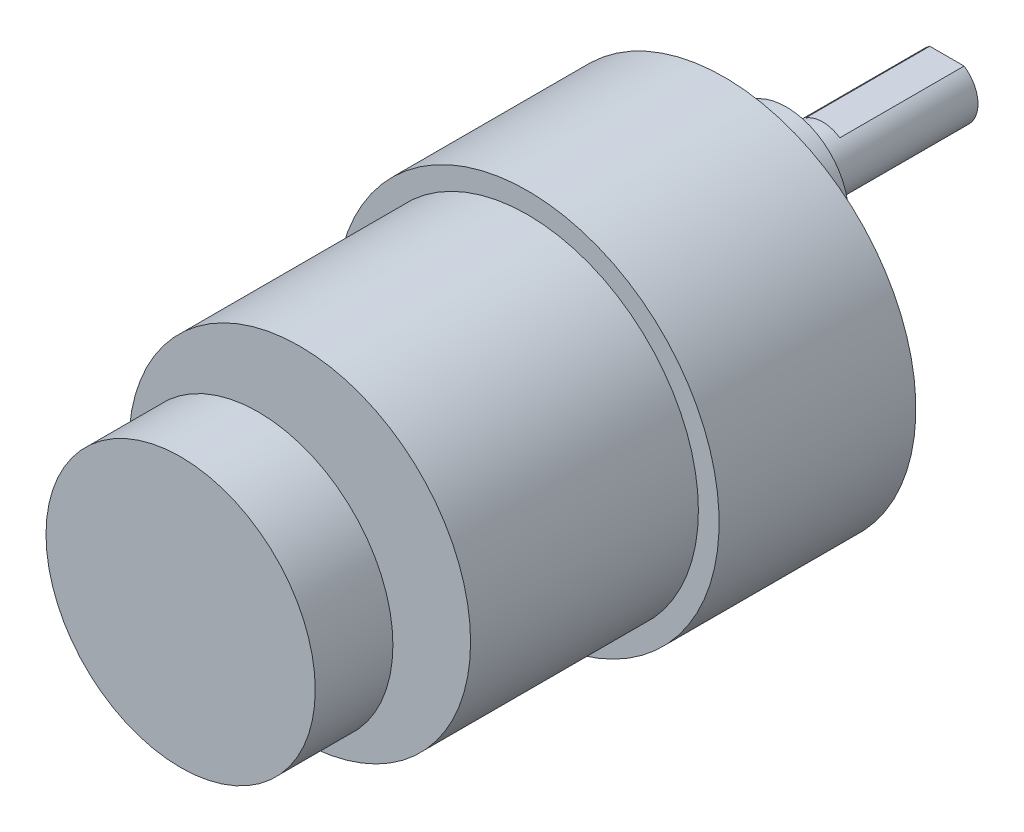
ISO-10303-21;
HEADER;
FILE_DESCRIPTION(('STEP AP214'),'2;1');
FILE_NAME('part.step','',(''),(''),'','','');
FILE_SCHEMA(('AUTOMOTIVE_DESIGN { 1 0 10303 214 1 1 1 1 }'));
ENDSEC;
DATA;
#1=APPLICATION_CONTEXT('core data for automotive mechanical design processes');
#2=APPLICATION_PROTOCOL_DEFINITION('international standard','automotive_design',2000,#1);
#3=PRODUCT_CONTEXT('',#1,'mechanical');
#4=PRODUCT('Part','Part','',(#3));
#5=PRODUCT_RELATED_PRODUCT_CATEGORY('part','',(#4));
#6=PRODUCT_DEFINITION_FORMATION('','',#4);
#7=PRODUCT_DEFINITION_CONTEXT('part definition',#1,'design');
#8=PRODUCT_DEFINITION('design','',#6,#7);
#9=PRODUCT_DEFINITION_SHAPE('','',#8);
#10=(LENGTH_UNIT() NAMED_UNIT(*) SI_UNIT(.MILLI.,.METRE.));
#11=(NAMED_UNIT(*) PLANE_ANGLE_UNIT() SI_UNIT($,.RADIAN.));
#12=(NAMED_UNIT(*) SI_UNIT($,.STERADIAN.) SOLID_ANGLE_UNIT());
#13=UNCERTAINTY_MEASURE_WITH_UNIT(LENGTH_MEASURE(1.E-05),#10,'distance_accuracy_value','');
#14=(GEOMETRIC_REPRESENTATION_CONTEXT(3) GLOBAL_UNCERTAINTY_ASSIGNED_CONTEXT((#13)) GLOBAL_UNIT_ASSIGNED_CONTEXT((#10,
#11,#12)) REPRESENTATION_CONTEXT('',''));
#15=CARTESIAN_POINT('',(0.,0.,0.));
#16=DIRECTION('',(0.,0.,1.));
#17=DIRECTION('',(1.,0.,0.));
#18=AXIS2_PLACEMENT_3D('',#15,#16,#17);
#19=CARTESIAN_POINT('',(0.,0.,22.));
#20=DIRECTION('',(0.,0.,1.));
#21=DIRECTION('',(1.,0.,0.));
#22=AXIS2_PLACEMENT_3D('',#19,#20,#21);
#23=PLANE('',#22);
#24=CARTESIAN_POINT('',(0.,0.,22.));
#25=DIRECTION('',(0.,0.,1.));
#26=DIRECTION('',(1.,0.,0.));
#27=AXIS2_PLACEMENT_3D('',#24,#25,#26);
#28=CIRCLE('',#27,16.5);
#29=CARTESIAN_POINT('',(16.5,0.,22.));
#30=VERTEX_POINT('',#29);
#31=EDGE_CURVE('E52',#30,#30,#28,.T.);
#32=ORIENTED_EDGE('',*,*,#31,.T.);
#33=EDGE_LOOP('',(#32));
#34=FACE_BOUND('',#33,.T.);
#35=DIRECTION('',(1.,0.,0.));
#36=VECTOR('',#35,1.);
#37=CARTESIAN_POINT('',(-6.06813562203251,-2.5,22.));
#38=LINE('',#37,#36);
#39=CARTESIAN_POINT('',(-6.06813562203251,-2.5,22.));
#40=VERTEX_POINT('',#39);
#41=CARTESIAN_POINT('',(-4.06813562203251,-2.5,22.));
#42=VERTEX_POINT('',#41);
#43=EDGE_CURVE('E176',#40,#42,#38,.T.);
#44=ORIENTED_EDGE('',*,*,#43,.F.);
#45=DIRECTION('',(0.,-1.,0.));
#46=VECTOR('',#45,1.);
#47=CARTESIAN_POINT('',(-6.06813562203251,2.5,22.));
#48=LINE('',#47,#46);
#49=CARTESIAN_POINT('',(-6.06813562203251,2.5,22.));
#50=VERTEX_POINT('',#49);
#51=EDGE_CURVE('E181',#50,#40,#48,.T.);
#52=ORIENTED_EDGE('',*,*,#51,.F.);
#53=DIRECTION('',(-1.,0.,0.));
#54=VECTOR('',#53,1.);
#55=CARTESIAN_POINT('',(-6.06813562203251,2.5,22.));
#56=LINE('',#55,#54);
#57=CARTESIAN_POINT('',(-4.06813562203251,2.5,22.));
#58=VERTEX_POINT('',#57);
#59=EDGE_CURVE('E166',#58,#50,#56,.T.);
#60=ORIENTED_EDGE('',*,*,#59,.F.);
#61=DIRECTION('',(0.,1.,0.));
#62=VECTOR('',#61,1.);
#63=CARTESIAN_POINT('',(-4.06813562203251,2.5,22.));
#64=LINE('',#63,#62);
#65=EDGE_CURVE('E172',#42,#58,#64,.T.);
#66=ORIENTED_EDGE('',*,*,#65,.F.);
#67=EDGE_LOOP('',(#44,#52,#60,#66));
#68=FACE_BOUND('',#67,.T.);
#69=DIRECTION('',(0.,-1.,0.));
#70=VECTOR('',#69,1.);
#71=CARTESIAN_POINT('',(4.06813562203251,2.5,22.));
#72=LINE('',#71,#70);
#73=CARTESIAN_POINT('',(4.06813562203251,2.5,22.));
#74=VERTEX_POINT('',#73);
#75=CARTESIAN_POINT('',(4.06813562203251,-2.5,22.));
#76=VERTEX_POINT('',#75);
#77=EDGE_CURVE('E128',#74,#76,#72,.T.);
#78=ORIENTED_EDGE('',*,*,#77,.F.);
#79=DIRECTION('',(-1.,0.,0.));
#80=VECTOR('',#79,1.);
#81=CARTESIAN_POINT('',(6.06813562203251,2.5,22.));
#82=LINE('',#81,#80);
#83=CARTESIAN_POINT('',(6.06813562203251,2.5,22.));
#84=VERTEX_POINT('',#83);
#85=EDGE_CURVE('E132',#84,#74,#82,.T.);
#86=ORIENTED_EDGE('',*,*,#85,.F.);
#87=DIRECTION('',(0.,1.,0.));
#88=VECTOR('',#87,1.);
#89=CARTESIAN_POINT('',(6.06813562203251,2.5,22.));
#90=LINE('',#89,#88);
#91=CARTESIAN_POINT('',(6.06813562203251,-2.5,22.));
#92=VERTEX_POINT('',#91);
#93=EDGE_CURVE('E153',#92,#84,#90,.T.);
#94=ORIENTED_EDGE('',*,*,#93,.F.);
#95=DIRECTION('',(1.,0.,0.));
#96=VECTOR('',#95,1.);
#97=CARTESIAN_POINT('',(6.06813562203251,-2.5,22.));
#98=LINE('',#97,#96);
#99=EDGE_CURVE('E60',#76,#92,#98,.T.);
#100=ORIENTED_EDGE('',*,*,#99,.F.);
#101=EDGE_LOOP('',(#78,#86,#94,#100));
#102=FACE_BOUND('',#101,.T.);
#103=ADVANCED_FACE('F42',(#34,#68,#102),#23,.T.);
#104=CARTESIAN_POINT('',(0.,0.,26.));
#105=DIRECTION('',(0.,0.,1.));
#106=DIRECTION('',(1.,0.,0.));
#107=AXIS2_PLACEMENT_3D('',#104,#105,#106);
#108=PLANE('',#107);
#109=DIRECTION('',(0.,1.,0.));
#110=VECTOR('',#109,1.);
#111=CARTESIAN_POINT('',(-4.06813562203251,2.5,26.));
#112=LINE('',#111,#110);
#113=CARTESIAN_POINT('',(-4.06813562203251,-2.5,26.));
#114=VERTEX_POINT('',#113);
#115=CARTESIAN_POINT('',(-4.06813562203251,2.5,26.));
#116=VERTEX_POINT('',#115);
#117=EDGE_CURVE('E185',#114,#116,#112,.T.);
#118=ORIENTED_EDGE('',*,*,#117,.T.);
#119=DIRECTION('',(-1.,0.,0.));
#120=VECTOR('',#119,1.);
#121=CARTESIAN_POINT('',(-6.06813562203251,2.5,26.));
#122=LINE('',#121,#120);
#123=CARTESIAN_POINT('',(-6.06813562203251,2.5,26.));
#124=VERTEX_POINT('',#123);
#125=EDGE_CURVE('E170',#116,#124,#122,.T.);
#126=ORIENTED_EDGE('',*,*,#125,.T.);
#127=DIRECTION('',(0.,-1.,0.));
#128=VECTOR('',#127,1.);
#129=CARTESIAN_POINT('',(-6.06813562203251,2.5,26.));
#130=LINE('',#129,#128);
#131=CARTESIAN_POINT('',(-6.06813562203251,-2.5,26.));
#132=VERTEX_POINT('',#131);
#133=EDGE_CURVE('E194',#124,#132,#130,.T.);
#134=ORIENTED_EDGE('',*,*,#133,.T.);
#135=DIRECTION('',(1.,0.,0.));
#136=VECTOR('',#135,1.);
#137=CARTESIAN_POINT('',(-6.06813562203251,-2.5,26.));
#138=LINE('',#137,#136);
#139=EDGE_CURVE('E190',#132,#114,#138,.T.);
#140=ORIENTED_EDGE('',*,*,#139,.T.);
#141=EDGE_LOOP('',(#118,#126,#134,#140));
#142=FACE_BOUND('',#141,.T.);
#143=CARTESIAN_POINT('',(0.,0.,26.));
#144=DIRECTION('',(0.,0.,1.));
#145=DIRECTION('',(1.,0.,0.));
#146=AXIS2_PLACEMENT_3D('',#143,#144,#145);
#147=CIRCLE('',#146,13.);
#148=CARTESIAN_POINT('',(13.,0.,26.));
#149=VERTEX_POINT('',#148);
#150=EDGE_CURVE('E162',#149,#149,#147,.T.);
#151=ORIENTED_EDGE('',*,*,#150,.F.);
#152=EDGE_LOOP('',(#151));
#153=FACE_BOUND('',#152,.T.);
#154=DIRECTION('',(-1.,0.,0.));
#155=VECTOR('',#154,1.);
#156=CARTESIAN_POINT('',(6.06813562203251,2.5,26.));
#157=LINE('',#156,#155);
#158=CARTESIAN_POINT('',(6.06813562203251,2.5,26.));
#159=VERTEX_POINT('',#158);
#160=CARTESIAN_POINT('',(4.06813562203251,2.5,26.));
#161=VERTEX_POINT('',#160);
#162=EDGE_CURVE('E68',#159,#161,#157,.T.);
#163=ORIENTED_EDGE('',*,*,#162,.T.);
#164=DIRECTION('',(0.,-1.,0.));
#165=VECTOR('',#164,1.);
#166=CARTESIAN_POINT('',(4.06813562203251,2.5,26.));
#167=LINE('',#166,#165);
#168=CARTESIAN_POINT('',(4.06813562203251,-2.5,26.));
#169=VERTEX_POINT('',#168);
#170=EDGE_CURVE('E129',#161,#169,#167,.T.);
#171=ORIENTED_EDGE('',*,*,#170,.T.);
#172=DIRECTION('',(1.,0.,0.));
#173=VECTOR('',#172,1.);
#174=CARTESIAN_POINT('',(6.06813562203251,-2.5,26.));
#175=LINE('',#174,#173);
#176=CARTESIAN_POINT('',(6.06813562203251,-2.5,26.));
#177=VERTEX_POINT('',#176);
#178=EDGE_CURVE('E729',#169,#177,#175,.T.);
#179=ORIENTED_EDGE('',*,*,#178,.T.);
#180=DIRECTION('',(0.,1.,0.));
#181=VECTOR('',#180,1.);
#182=CARTESIAN_POINT('',(6.06813562203251,2.5,26.));
#183=LINE('',#182,#181);
#184=EDGE_CURVE('E156',#177,#159,#183,.T.);
#185=ORIENTED_EDGE('',*,*,#184,.T.);
#186=EDGE_LOOP('',(#163,#171,#179,#185));
#187=FACE_BOUND('',#186,.T.);
#188=ADVANCED_FACE('F320',(#142,#153,#187),#108,.F.);
#189=CARTESIAN_POINT('',(0.,0.,22.));
#190=DIRECTION('',(0.,0.,-1.));
#191=DIRECTION('',(-1.,0.,0.));
#192=AXIS2_PLACEMENT_3D('',#189,#190,#191);
#193=CYLINDRICAL_SURFACE('',#192,16.5);
#194=ORIENTED_EDGE('',*,*,#31,.F.);
#195=EDGE_LOOP('',(#194));
#196=FACE_BOUND('',#195,.T.);
#197=CARTESIAN_POINT('',(0.,0.,0.));
#198=DIRECTION('',(0.,0.,1.));
#199=DIRECTION('',(1.,0.,0.));
#200=AXIS2_PLACEMENT_3D('',#197,#198,#199);
#201=CIRCLE('',#200,16.5);
#202=CARTESIAN_POINT('',(16.5,0.,0.));
#203=VERTEX_POINT('',#202);
#204=EDGE_CURVE('E46',#203,#203,#201,.T.);
#205=ORIENTED_EDGE('',*,*,#204,.T.);
#206=EDGE_LOOP('',(#205));
#207=FACE_BOUND('',#206,.T.);
#208=ADVANCED_FACE('F44',(#196,#207),#193,.T.);
#209=CARTESIAN_POINT('',(0.,0.,-19.));
#210=DIRECTION('',(0.,0.,1.));
#211=DIRECTION('',(1.,0.,0.));
#212=AXIS2_PLACEMENT_3D('',#209,#210,#211);
#213=CYLINDRICAL_SURFACE('',#212,18.5);
#214=CARTESIAN_POINT('',(0.,0.,-19.));
#215=DIRECTION('',(0.,0.,-1.));
#216=DIRECTION('',(-1.,0.,0.));
#217=AXIS2_PLACEMENT_3D('',#214,#215,#216);
#218=CIRCLE('',#217,18.5);
#219=CARTESIAN_POINT('',(-18.5,0.,-19.));
#220=VERTEX_POINT('',#219);
#221=EDGE_CURVE('E287',#220,#220,#218,.T.);
#222=ORIENTED_EDGE('',*,*,#221,.F.);
#223=EDGE_LOOP('',(#222));
#224=FACE_BOUND('',#223,.T.);
#225=CARTESIAN_POINT('',(0.,0.,0.));
#226=DIRECTION('',(0.,0.,-1.));
#227=DIRECTION('',(-1.,0.,0.));
#228=AXIS2_PLACEMENT_3D('',#225,#226,#227);
#229=CIRCLE('',#228,18.5);
#230=CARTESIAN_POINT('',(-18.5,0.,0.));
#231=VERTEX_POINT('',#230);
#232=EDGE_CURVE('E283',#231,#231,#229,.T.);
#233=ORIENTED_EDGE('',*,*,#232,.T.);
#234=EDGE_LOOP('',(#233));
#235=FACE_BOUND('',#234,.T.);
#236=ADVANCED_FACE('F310',(#224,#235),#213,.T.);
#237=CARTESIAN_POINT('',(0.,0.,-19.));
#238=DIRECTION('',(0.,0.,-1.));
#239=DIRECTION('',(-1.,0.,0.));
#240=AXIS2_PLACEMENT_3D('',#237,#238,#239);
#241=PLANE('',#240);
#242=CARTESIAN_POINT('',(15.5,0.,-19.));
#243=DIRECTION('',(0.,0.,-1.));
#244=DIRECTION('',(-1.,0.,0.));
#245=AXIS2_PLACEMENT_3D('',#242,#243,#244);
#246=CIRCLE('',#245,1.5);
#247=CARTESIAN_POINT('',(14.,0.,-19.));
#248=VERTEX_POINT('',#247);
#249=EDGE_CURVE('E215',#248,#248,#246,.T.);
#250=ORIENTED_EDGE('',*,*,#249,.F.);
#251=EDGE_LOOP('',(#250));
#252=FACE_BOUND('',#251,.T.);
#253=CARTESIAN_POINT('',(7.75000000000016,-13.4233937586587,-19.));
#254=DIRECTION('',(0.,0.,-1.));
#255=DIRECTION('',(-1.,0.,0.));
#256=AXIS2_PLACEMENT_3D('',#253,#254,#255);
#257=CIRCLE('',#256,1.5);
#258=CARTESIAN_POINT('',(6.25000000000015,-13.4233937586587,-19.));
#259=VERTEX_POINT('',#258);
#260=EDGE_CURVE('E220',#259,#259,#257,.T.);
#261=ORIENTED_EDGE('',*,*,#260,.F.);
#262=EDGE_LOOP('',(#261));
#263=FACE_BOUND('',#262,.T.);
#264=CARTESIAN_POINT('',(-7.74999999999987,-13.4233937586589,-19.));
#265=DIRECTION('',(0.,0.,-1.));
#266=DIRECTION('',(-1.,0.,0.));
#267=AXIS2_PLACEMENT_3D('',#264,#265,#266);
#268=CIRCLE('',#267,1.5);
#269=CARTESIAN_POINT('',(-9.24999999999988,-13.4233937586589,-19.));
#270=VERTEX_POINT('',#269);
#271=EDGE_CURVE('E251',#270,#270,#268,.T.);
#272=ORIENTED_EDGE('',*,*,#271,.F.);
#273=EDGE_LOOP('',(#272));
#274=FACE_BOUND('',#273,.T.);
#275=CARTESIAN_POINT('',(-15.5,-1.08235921504137E-13,-19.));
#276=DIRECTION('',(0.,0.,-1.));
#277=DIRECTION('',(-1.,0.,0.));
#278=AXIS2_PLACEMENT_3D('',#275,#276,#277);
#279=CIRCLE('',#278,1.5);
#280=CARTESIAN_POINT('',(-17.,-1.08235921504137E-13,-19.));
#281=VERTEX_POINT('',#280);
#282=EDGE_CURVE('E243',#281,#281,#279,.T.);
#283=ORIENTED_EDGE('',*,*,#282,.F.);
#284=EDGE_LOOP('',(#283));
#285=FACE_BOUND('',#284,.T.);
#286=CARTESIAN_POINT('',(-7.75000000000006,13.4233937586588,-19.));
#287=DIRECTION('',(0.,0.,-1.));
#288=DIRECTION('',(-1.,0.,0.));
#289=AXIS2_PLACEMENT_3D('',#286,#287,#288);
#290=CIRCLE('',#289,1.5);
#291=CARTESIAN_POINT('',(-9.25000000000006,13.4233937586588,-19.));
#292=VERTEX_POINT('',#291);
#293=EDGE_CURVE('E235',#292,#292,#290,.T.);
#294=ORIENTED_EDGE('',*,*,#293,.F.);
#295=EDGE_LOOP('',(#294));
#296=FACE_BOUND('',#295,.T.);
#297=CARTESIAN_POINT('',(7.74999999999997,13.4233937586588,-19.));
#298=DIRECTION('',(0.,0.,-1.));
#299=DIRECTION('',(-1.,0.,0.));
#300=AXIS2_PLACEMENT_3D('',#297,#298,#299);
#301=CIRCLE('',#300,1.5);
#302=CARTESIAN_POINT('',(6.24999999999997,13.4233937586588,-19.));
#303=VERTEX_POINT('',#302);
#304=EDGE_CURVE('E219',#303,#303,#301,.T.);
#305=ORIENTED_EDGE('',*,*,#304,.F.);
#306=EDGE_LOOP('',(#305));
#307=FACE_BOUND('',#306,.T.);
#308=CARTESIAN_POINT('',(0.,7.,-19.));
#309=DIRECTION('',(0.,0.,-1.));
#310=DIRECTION('',(-1.,0.,0.));
#311=AXIS2_PLACEMENT_3D('',#308,#309,#310);
#312=CIRCLE('',#311,6.);
#313=CARTESIAN_POINT('',(-6.,7.,-19.));
#314=VERTEX_POINT('',#313);
#315=EDGE_CURVE('E277',#314,#314,#312,.T.);
#316=ORIENTED_EDGE('',*,*,#315,.F.);
#317=EDGE_LOOP('',(#316));
#318=FACE_BOUND('',#317,.T.);
#319=ORIENTED_EDGE('',*,*,#221,.T.);
#320=EDGE_LOOP('',(#319));
#321=FACE_BOUND('',#320,.T.);
#322=ADVANCED_FACE('F306',(#252,#263,#274,#285,#296,#307,#318,#321),#241,.T.);
#323=CARTESIAN_POINT('',(0.,0.,0.));
#324=DIRECTION('',(0.,0.,-1.));
#325=DIRECTION('',(-1.,0.,0.));
#326=AXIS2_PLACEMENT_3D('',#323,#324,#325);
#327=PLANE('',#326);
#328=ORIENTED_EDGE('',*,*,#204,.F.);
#329=EDGE_LOOP('',(#328));
#330=FACE_BOUND('',#329,.T.);
#331=ORIENTED_EDGE('',*,*,#232,.F.);
#332=EDGE_LOOP('',(#331));
#333=FACE_BOUND('',#332,.T.);
#334=ADVANCED_FACE('F302',(#330,#333),#327,.F.);
#335=CARTESIAN_POINT('',(0.,7.,-25.));
#336=DIRECTION('',(0.,0.,1.));
#337=DIRECTION('',(1.,0.,0.));
#338=AXIS2_PLACEMENT_3D('',#335,#336,#337);
#339=CYLINDRICAL_SURFACE('',#338,6.);
#340=CARTESIAN_POINT('',(0.,7.,-25.));
#341=DIRECTION('',(0.,0.,-1.));
#342=DIRECTION('',(-1.,0.,0.));
#343=AXIS2_PLACEMENT_3D('',#340,#341,#342);
#344=CIRCLE('',#343,6.);
#345=CARTESIAN_POINT('',(-6.,7.,-25.));
#346=VERTEX_POINT('',#345);
#347=EDGE_CURVE('E279',#346,#346,#344,.T.);
#348=ORIENTED_EDGE('',*,*,#347,.F.);
#349=EDGE_LOOP('',(#348));
#350=FACE_BOUND('',#349,.T.);
#351=ORIENTED_EDGE('',*,*,#315,.T.);
#352=EDGE_LOOP('',(#351));
#353=FACE_BOUND('',#352,.T.);
#354=ADVANCED_FACE('F305',(#350,#353),#339,.T.);
#355=CARTESIAN_POINT('',(0.,7.,-25.));
#356=DIRECTION('',(0.,0.,-1.));
#357=DIRECTION('',(-1.,0.,0.));
#358=AXIS2_PLACEMENT_3D('',#355,#356,#357);
#359=PLANE('',#358);
#360=CARTESIAN_POINT('',(0.,7.,-25.));
#361=DIRECTION('',(0.,0.,-1.));
#362=DIRECTION('',(-1.,0.,0.));
#363=AXIS2_PLACEMENT_3D('',#360,#361,#362);
#364=CIRCLE('',#363,3.);
#365=CARTESIAN_POINT('',(-3.,7.,-25.));
#366=VERTEX_POINT('',#365);
#367=EDGE_CURVE('E11',#366,#366,#364,.T.);
#368=ORIENTED_EDGE('',*,*,#367,.F.);
#369=EDGE_LOOP('',(#368));
#370=FACE_BOUND('',#369,.T.);
#371=ORIENTED_EDGE('',*,*,#347,.T.);
#372=EDGE_LOOP('',(#371));
#373=FACE_BOUND('',#372,.T.);
#374=ADVANCED_FACE('F432',(#370,#373),#359,.T.);
#375=CARTESIAN_POINT('',(0.,7.,-40.5));
#376=DIRECTION('',(0.,0.,1.));
#377=DIRECTION('',(1.,0.,0.));
#378=AXIS2_PLACEMENT_3D('',#375,#376,#377);
#379=CYLINDRICAL_SURFACE('',#378,3.);
#380=CARTESIAN_POINT('',(0.,7.,-40.5));
#381=DIRECTION('',(0.,0.,-1.));
#382=DIRECTION('',(-1.,0.,0.));
#383=AXIS2_PLACEMENT_3D('',#380,#381,#382);
#384=CIRCLE('',#383,3.);
#385=CARTESIAN_POINT('',(1.6583123951777,9.5,-40.5));
#386=VERTEX_POINT('',#385);
#387=CARTESIAN_POINT('',(-1.6583123951777,9.5,-40.5));
#388=VERTEX_POINT('',#387);
#389=EDGE_CURVE('E272',#386,#388,#384,.T.);
#390=ORIENTED_EDGE('',*,*,#389,.F.);
#391=DIRECTION('',(0.,0.,-1.));
#392=VECTOR('',#391,1.);
#393=CARTESIAN_POINT('',(1.6583123951777,9.5,-28.5));
#394=LINE('',#393,#392);
#395=CARTESIAN_POINT('',(1.6583123951777,9.5,-28.5));
#396=VERTEX_POINT('',#395);
#397=EDGE_CURVE('E265',#396,#386,#394,.T.);
#398=ORIENTED_EDGE('',*,*,#397,.F.);
#399=CARTESIAN_POINT('',(0.,7.,-28.5));
#400=DIRECTION('',(0.,0.,-1.));
#401=DIRECTION('',(-1.,0.,0.));
#402=AXIS2_PLACEMENT_3D('',#399,#400,#401);
#403=CIRCLE('',#402,3.);
#404=CARTESIAN_POINT('',(-1.6583123951777,9.5,-28.5));
#405=VERTEX_POINT('',#404);
#406=EDGE_CURVE('E258',#405,#396,#403,.T.);
#407=ORIENTED_EDGE('',*,*,#406,.F.);
#408=DIRECTION('',(0.,0.,-1.));
#409=VECTOR('',#408,1.);
#410=CARTESIAN_POINT('',(-1.6583123951777,9.5,-28.5));
#411=LINE('',#410,#409);
#412=EDGE_CURVE('E268',#405,#388,#411,.T.);
#413=ORIENTED_EDGE('',*,*,#412,.T.);
#414=EDGE_LOOP('',(#390,#398,#407,#413));
#415=FACE_BOUND('',#414,.T.);
#416=ORIENTED_EDGE('',*,*,#367,.T.);
#417=EDGE_LOOP('',(#416));
#418=FACE_BOUND('',#417,.T.);
#419=ADVANCED_FACE('F428',(#415,#418),#379,.T.);
#420=CARTESIAN_POINT('',(0.,7.,-40.5));
#421=DIRECTION('',(0.,0.,-1.));
#422=DIRECTION('',(-1.,0.,0.));
#423=AXIS2_PLACEMENT_3D('',#420,#421,#422);
#424=PLANE('',#423);
#425=DIRECTION('',(-1.,0.,0.));
#426=VECTOR('',#425,1.);
#427=CARTESIAN_POINT('',(0.,9.5,-40.5));
#428=LINE('',#427,#426);
#429=EDGE_CURVE('E214',#386,#388,#428,.T.);
#430=ORIENTED_EDGE('',*,*,#429,.F.);
#431=ORIENTED_EDGE('',*,*,#389,.T.);
#432=EDGE_LOOP('',(#430,#431));
#433=FACE_BOUND('',#432,.T.);
#434=ADVANCED_FACE('F424',(#433),#424,.T.);
#435=CARTESIAN_POINT('',(0.,9.5,-28.5));
#436=DIRECTION('',(0.,-1.,0.));
#437=DIRECTION('',(0.,0.,-1.));
#438=AXIS2_PLACEMENT_3D('',#435,#436,#437);
#439=PLANE('',#438);
#440=ORIENTED_EDGE('',*,*,#429,.T.);
#441=ORIENTED_EDGE('',*,*,#412,.F.);
#442=DIRECTION('',(-1.,0.,0.));
#443=VECTOR('',#442,1.);
#444=CARTESIAN_POINT('',(0.,9.5,-28.5));
#445=LINE('',#444,#443);
#446=EDGE_CURVE('E261',#396,#405,#445,.T.);
#447=ORIENTED_EDGE('',*,*,#446,.F.);
#448=ORIENTED_EDGE('',*,*,#397,.T.);
#449=EDGE_LOOP('',(#440,#441,#447,#448));
#450=FACE_BOUND('',#449,.T.);
#451=ADVANCED_FACE('F420',(#450),#439,.F.);
#452=CARTESIAN_POINT('',(0.,0.,-28.5));
#453=DIRECTION('',(0.,0.,-1.));
#454=DIRECTION('',(-1.,0.,0.));
#455=AXIS2_PLACEMENT_3D('',#452,#453,#454);
#456=PLANE('',#455);
#457=ORIENTED_EDGE('',*,*,#406,.T.);
#458=ORIENTED_EDGE('',*,*,#446,.T.);
#459=EDGE_LOOP('',(#457,#458));
#460=FACE_BOUND('',#459,.T.);
#461=ADVANCED_FACE('F390',(#460),#456,.T.);
#462=CARTESIAN_POINT('',(7.74999999999997,13.4233937586588,-14.));
#463=DIRECTION('',(0.,0.,-1.));
#464=DIRECTION('',(-1.,0.,0.));
#465=AXIS2_PLACEMENT_3D('',#462,#463,#464);
#466=CYLINDRICAL_SURFACE('',#465,1.5);
#467=CARTESIAN_POINT('',(7.74999999999997,13.4233937586588,-14.));
#468=DIRECTION('',(0.,0.,-1.));
#469=DIRECTION('',(-1.,0.,0.));
#470=AXIS2_PLACEMENT_3D('',#467,#468,#469);
#471=CIRCLE('',#470,1.5);
#472=CARTESIAN_POINT('',(6.24999999999997,13.4233937586588,-14.));
#473=VERTEX_POINT('',#472);
#474=EDGE_CURVE('E231',#473,#473,#471,.T.);
#475=ORIENTED_EDGE('',*,*,#474,.F.);
#476=EDGE_LOOP('',(#475));
#477=FACE_BOUND('',#476,.T.);
#478=ORIENTED_EDGE('',*,*,#304,.T.);
#479=EDGE_LOOP('',(#478));
#480=FACE_BOUND('',#479,.T.);
#481=ADVANCED_FACE('F386',(#477,#480),#466,.F.);
#482=CARTESIAN_POINT('',(7.74999999999997,13.4233937586588,-14.));
#483=DIRECTION('',(0.,0.,-1.));
#484=DIRECTION('',(-1.,0.,0.));
#485=AXIS2_PLACEMENT_3D('',#482,#483,#484);
#486=PLANE('',#485);
#487=ORIENTED_EDGE('',*,*,#474,.T.);
#488=EDGE_LOOP('',(#487));
#489=FACE_BOUND('',#488,.T.);
#490=ADVANCED_FACE('F389',(#489),#486,.T.);
#491=CARTESIAN_POINT('',(-7.75000000000006,13.4233937586588,-14.));
#492=DIRECTION('',(0.,0.,-1.));
#493=DIRECTION('',(-1.,0.,0.));
#494=AXIS2_PLACEMENT_3D('',#491,#492,#493);
#495=CYLINDRICAL_SURFACE('',#494,1.5);
#496=CARTESIAN_POINT('',(-7.75000000000006,13.4233937586588,-14.));
#497=DIRECTION('',(0.,0.,-1.));
#498=DIRECTION('',(-1.,0.,0.));
#499=AXIS2_PLACEMENT_3D('',#496,#497,#498);
#500=CIRCLE('',#499,1.5);
#501=CARTESIAN_POINT('',(-9.25000000000006,13.4233937586588,-14.));
#502=VERTEX_POINT('',#501);
#503=EDGE_CURVE('E239',#502,#502,#500,.T.);
#504=ORIENTED_EDGE('',*,*,#503,.F.);
#505=EDGE_LOOP('',(#504));
#506=FACE_BOUND('',#505,.T.);
#507=ORIENTED_EDGE('',*,*,#293,.T.);
#508=EDGE_LOOP('',(#507));
#509=FACE_BOUND('',#508,.T.);
#510=ADVANCED_FACE('F394',(#506,#509),#495,.F.);
#511=CARTESIAN_POINT('',(-7.75000000000006,13.4233937586588,-14.));
#512=DIRECTION('',(0.,0.,-1.));
#513=DIRECTION('',(-1.,0.,0.));
#514=AXIS2_PLACEMENT_3D('',#511,#512,#513);
#515=PLANE('',#514);
#516=ORIENTED_EDGE('',*,*,#503,.T.);
#517=EDGE_LOOP('',(#516));
#518=FACE_BOUND('',#517,.T.);
#519=ADVANCED_FACE('F398',(#518),#515,.T.);
#520=CARTESIAN_POINT('',(-15.5,-1.08235921504137E-13,-14.));
#521=DIRECTION('',(0.,0.,-1.));
#522=DIRECTION('',(-1.,0.,0.));
#523=AXIS2_PLACEMENT_3D('',#520,#521,#522);
#524=CYLINDRICAL_SURFACE('',#523,1.5);
#525=CARTESIAN_POINT('',(-15.5,-1.08235921504137E-13,-14.));
#526=DIRECTION('',(0.,0.,-1.));
#527=DIRECTION('',(-1.,0.,0.));
#528=AXIS2_PLACEMENT_3D('',#525,#526,#527);
#529=CIRCLE('',#528,1.5);
#530=CARTESIAN_POINT('',(-17.,-1.08235921504137E-13,-14.));
#531=VERTEX_POINT('',#530);
#532=EDGE_CURVE('E247',#531,#531,#529,.T.);
#533=ORIENTED_EDGE('',*,*,#532,.F.);
#534=EDGE_LOOP('',(#533));
#535=FACE_BOUND('',#534,.T.);
#536=ORIENTED_EDGE('',*,*,#282,.T.);
#537=EDGE_LOOP('',(#536));
#538=FACE_BOUND('',#537,.T.);
#539=ADVANCED_FACE('F402',(#535,#538),#524,.F.);
#540=CARTESIAN_POINT('',(-15.5,-1.08235921504137E-13,-14.));
#541=DIRECTION('',(0.,0.,-1.));
#542=DIRECTION('',(-1.,0.,0.));
#543=AXIS2_PLACEMENT_3D('',#540,#541,#542);
#544=PLANE('',#543);
#545=ORIENTED_EDGE('',*,*,#532,.T.);
#546=EDGE_LOOP('',(#545));
#547=FACE_BOUND('',#546,.T.);
#548=ADVANCED_FACE('F406',(#547),#544,.T.);
#549=CARTESIAN_POINT('',(-7.74999999999987,-13.4233937586589,-14.));
#550=DIRECTION('',(0.,0.,-1.));
#551=DIRECTION('',(-1.,0.,0.));
#552=AXIS2_PLACEMENT_3D('',#549,#550,#551);
#553=CYLINDRICAL_SURFACE('',#552,1.5);
#554=CARTESIAN_POINT('',(-7.74999999999987,-13.4233937586589,-14.));
#555=DIRECTION('',(0.,0.,-1.));
#556=DIRECTION('',(-1.,0.,0.));
#557=AXIS2_PLACEMENT_3D('',#554,#555,#556);
#558=CIRCLE('',#557,1.5);
#559=CARTESIAN_POINT('',(-9.24999999999988,-13.4233937586589,-14.));
#560=VERTEX_POINT('',#559);
#561=EDGE_CURVE('E224',#560,#560,#558,.T.);
#562=ORIENTED_EDGE('',*,*,#561,.F.);
#563=EDGE_LOOP('',(#562));
#564=FACE_BOUND('',#563,.T.);
#565=ORIENTED_EDGE('',*,*,#271,.T.);
#566=EDGE_LOOP('',(#565));
#567=FACE_BOUND('',#566,.T.);
#568=ADVANCED_FACE('F410',(#564,#567),#553,.F.);
#569=CARTESIAN_POINT('',(-7.74999999999987,-13.4233937586589,-14.));
#570=DIRECTION('',(0.,0.,-1.));
#571=DIRECTION('',(-1.,0.,0.));
#572=AXIS2_PLACEMENT_3D('',#569,#570,#571);
#573=PLANE('',#572);
#574=ORIENTED_EDGE('',*,*,#561,.T.);
#575=EDGE_LOOP('',(#574));
#576=FACE_BOUND('',#575,.T.);
#577=ADVANCED_FACE('F381',(#576),#573,.T.);
#578=CARTESIAN_POINT('',(7.75000000000016,-13.4233937586587,-14.));
#579=DIRECTION('',(0.,0.,-1.));
#580=DIRECTION('',(-1.,0.,0.));
#581=AXIS2_PLACEMENT_3D('',#578,#579,#580);
#582=CYLINDRICAL_SURFACE('',#581,1.5);
#583=CARTESIAN_POINT('',(7.75000000000016,-13.4233937586587,-14.));
#584=DIRECTION('',(0.,0.,-1.));
#585=DIRECTION('',(-1.,0.,0.));
#586=AXIS2_PLACEMENT_3D('',#583,#584,#585);
#587=CIRCLE('',#586,1.5);
#588=CARTESIAN_POINT('',(6.25000000000015,-13.4233937586587,-14.));
#589=VERTEX_POINT('',#588);
#590=EDGE_CURVE('E189',#589,#589,#587,.T.);
#591=ORIENTED_EDGE('',*,*,#590,.F.);
#592=EDGE_LOOP('',(#591));
#593=FACE_BOUND('',#592,.T.);
#594=ORIENTED_EDGE('',*,*,#260,.T.);
#595=EDGE_LOOP('',(#594));
#596=FACE_BOUND('',#595,.T.);
#597=ADVANCED_FACE('F378',(#593,#596),#582,.F.);
#598=CARTESIAN_POINT('',(7.75000000000016,-13.4233937586587,-14.));
#599=DIRECTION('',(0.,0.,-1.));
#600=DIRECTION('',(-1.,0.,0.));
#601=AXIS2_PLACEMENT_3D('',#598,#599,#600);
#602=PLANE('',#601);
#603=ORIENTED_EDGE('',*,*,#590,.T.);
#604=EDGE_LOOP('',(#603));
#605=FACE_BOUND('',#604,.T.);
#606=ADVANCED_FACE('F376',(#605),#602,.T.);
#607=CARTESIAN_POINT('',(15.5,0.,-14.));
#608=DIRECTION('',(0.,0.,-1.));
#609=DIRECTION('',(-1.,0.,0.));
#610=AXIS2_PLACEMENT_3D('',#607,#608,#609);
#611=CYLINDRICAL_SURFACE('',#610,1.5);
#612=CARTESIAN_POINT('',(15.5,0.,-14.));
#613=DIRECTION('',(0.,0.,-1.));
#614=DIRECTION('',(-1.,0.,0.));
#615=AXIS2_PLACEMENT_3D('',#612,#613,#614);
#616=CIRCLE('',#615,1.5);
#617=CARTESIAN_POINT('',(14.,0.,-14.));
#618=VERTEX_POINT('',#617);
#619=EDGE_CURVE('E210',#618,#618,#616,.T.);
#620=ORIENTED_EDGE('',*,*,#619,.F.);
#621=EDGE_LOOP('',(#620));
#622=FACE_BOUND('',#621,.T.);
#623=ORIENTED_EDGE('',*,*,#249,.T.);
#624=EDGE_LOOP('',(#623));
#625=FACE_BOUND('',#624,.T.);
#626=ADVANCED_FACE('F372',(#622,#625),#611,.F.);
#627=CARTESIAN_POINT('',(15.5,0.,-14.));
#628=DIRECTION('',(0.,0.,-1.));
#629=DIRECTION('',(-1.,0.,0.));
#630=AXIS2_PLACEMENT_3D('',#627,#628,#629);
#631=PLANE('',#630);
#632=ORIENTED_EDGE('',*,*,#619,.T.);
#633=EDGE_LOOP('',(#632));
#634=FACE_BOUND('',#633,.T.);
#635=ADVANCED_FACE('F369',(#634),#631,.T.);
#636=CARTESIAN_POINT('',(-6.06813562203251,2.5,31.3851648071345));
#637=DIRECTION('',(1.,0.,0.));
#638=DIRECTION('',(0.,0.,-1.));
#639=AXIS2_PLACEMENT_3D('',#636,#637,#638);
#640=PLANE('',#639);
#641=ORIENTED_EDGE('',*,*,#133,.F.);
#642=DIRECTION('',(0.,0.,-1.));
#643=VECTOR('',#642,1.);
#644=CARTESIAN_POINT('',(-6.06813562203251,2.5,31.3851648071345));
#645=LINE('',#644,#643);
#646=EDGE_CURVE('E161',#124,#50,#645,.T.);
#647=ORIENTED_EDGE('',*,*,#646,.T.);
#648=ORIENTED_EDGE('',*,*,#51,.T.);
#649=DIRECTION('',(0.,0.,-1.));
#650=VECTOR('',#649,1.);
#651=CARTESIAN_POINT('',(-6.06813562203251,-2.5,31.3851648071345));
#652=LINE('',#651,#650);
#653=EDGE_CURVE('E180',#132,#40,#652,.T.);
#654=ORIENTED_EDGE('',*,*,#653,.F.);
#655=EDGE_LOOP('',(#641,#647,#648,#654));
#656=FACE_BOUND('',#655,.T.);
#657=ADVANCED_FACE('F340',(#656),#640,.F.);
#658=CARTESIAN_POINT('',(-6.06813562203251,-2.5,31.3851648071345));
#659=DIRECTION('',(0.,1.,0.));
#660=DIRECTION('',(0.,0.,1.));
#661=AXIS2_PLACEMENT_3D('',#658,#659,#660);
#662=PLANE('',#661);
#663=ORIENTED_EDGE('',*,*,#139,.F.);
#664=ORIENTED_EDGE('',*,*,#653,.T.);
#665=ORIENTED_EDGE('',*,*,#43,.T.);
#666=DIRECTION('',(0.,0.,-1.));
#667=VECTOR('',#666,1.);
#668=CARTESIAN_POINT('',(-4.06813562203251,-2.5,31.3851648071345));
#669=LINE('',#668,#667);
#670=EDGE_CURVE('E175',#114,#42,#669,.T.);
#671=ORIENTED_EDGE('',*,*,#670,.F.);
#672=EDGE_LOOP('',(#663,#664,#665,#671));
#673=FACE_BOUND('',#672,.T.);
#674=ADVANCED_FACE('F336',(#673),#662,.F.);
#675=CARTESIAN_POINT('',(-4.06813562203251,2.5,31.3851648071345));
#676=DIRECTION('',(-1.,0.,0.));
#677=DIRECTION('',(0.,0.,1.));
#678=AXIS2_PLACEMENT_3D('',#675,#676,#677);
#679=PLANE('',#678);
#680=ORIENTED_EDGE('',*,*,#117,.F.);
#681=ORIENTED_EDGE('',*,*,#670,.T.);
#682=ORIENTED_EDGE('',*,*,#65,.T.);
#683=DIRECTION('',(0.,0.,-1.));
#684=VECTOR('',#683,1.);
#685=CARTESIAN_POINT('',(-4.06813562203251,2.5,31.3851648071345));
#686=LINE('',#685,#684);
#687=EDGE_CURVE('E171',#116,#58,#686,.T.);
#688=ORIENTED_EDGE('',*,*,#687,.F.);
#689=EDGE_LOOP('',(#680,#681,#682,#688));
#690=FACE_BOUND('',#689,.T.);
#691=ADVANCED_FACE('F345',(#690),#679,.F.);
#692=CARTESIAN_POINT('',(-6.06813562203251,2.5,31.3851648071345));
#693=DIRECTION('',(0.,-1.,0.));
#694=DIRECTION('',(0.,0.,-1.));
#695=AXIS2_PLACEMENT_3D('',#692,#693,#694);
#696=PLANE('',#695);
#697=ORIENTED_EDGE('',*,*,#125,.F.);
#698=ORIENTED_EDGE('',*,*,#687,.T.);
#699=ORIENTED_EDGE('',*,*,#59,.T.);
#700=ORIENTED_EDGE('',*,*,#646,.F.);
#701=EDGE_LOOP('',(#697,#698,#699,#700));
#702=FACE_BOUND('',#701,.T.);
#703=ADVANCED_FACE('F342',(#702),#696,.F.);
#704=CARTESIAN_POINT('',(0.,0.,33.5));
#705=DIRECTION('',(0.,0.,-1.));
#706=DIRECTION('',(-1.,0.,0.));
#707=AXIS2_PLACEMENT_3D('',#704,#705,#706);
#708=CYLINDRICAL_SURFACE('',#707,13.);
#709=CARTESIAN_POINT('',(0.,0.,33.5));
#710=DIRECTION('',(0.,0.,1.));
#711=DIRECTION('',(1.,0.,0.));
#712=AXIS2_PLACEMENT_3D('',#709,#710,#711);
#713=CIRCLE('',#712,13.);
#714=CARTESIAN_POINT('',(13.,0.,33.5));
#715=VERTEX_POINT('',#714);
#716=EDGE_CURVE('E157',#715,#715,#713,.T.);
#717=ORIENTED_EDGE('',*,*,#716,.F.);
#718=EDGE_LOOP('',(#717));
#719=FACE_BOUND('',#718,.T.);
#720=ORIENTED_EDGE('',*,*,#150,.T.);
#721=EDGE_LOOP('',(#720));
#722=FACE_BOUND('',#721,.T.);
#723=ADVANCED_FACE('F349',(#719,#722),#708,.T.);
#724=CARTESIAN_POINT('',(0.,0.,33.5));
#725=DIRECTION('',(0.,0.,1.));
#726=DIRECTION('',(1.,0.,0.));
#727=AXIS2_PLACEMENT_3D('',#724,#725,#726);
#728=PLANE('',#727);
#729=ORIENTED_EDGE('',*,*,#716,.T.);
#730=EDGE_LOOP('',(#729));
#731=FACE_BOUND('',#730,.T.);
#732=ADVANCED_FACE('F351',(#731),#728,.T.);
#733=CARTESIAN_POINT('',(6.06813562203251,2.5,31.3851648071345));
#734=DIRECTION('',(0.,-1.,0.));
#735=DIRECTION('',(0.,0.,-1.));
#736=AXIS2_PLACEMENT_3D('',#733,#734,#735);
#737=PLANE('',#736);
#738=ORIENTED_EDGE('',*,*,#162,.F.);
#739=DIRECTION('',(0.,0.,-1.));
#740=VECTOR('',#739,1.);
#741=CARTESIAN_POINT('',(6.06813562203251,2.5,31.3851648071345));
#742=LINE('',#741,#740);
#743=EDGE_CURVE('E137',#159,#84,#742,.T.);
#744=ORIENTED_EDGE('',*,*,#743,.T.);
#745=ORIENTED_EDGE('',*,*,#85,.T.);
#746=DIRECTION('',(0.,0.,-1.));
#747=VECTOR('',#746,1.);
#748=CARTESIAN_POINT('',(4.06813562203251,2.5,31.3851648071345));
#749=LINE('',#748,#747);
#750=EDGE_CURVE('E123',#161,#74,#749,.T.);
#751=ORIENTED_EDGE('',*,*,#750,.F.);
#752=EDGE_LOOP('',(#738,#744,#745,#751));
#753=FACE_BOUND('',#752,.T.);
#754=ADVANCED_FACE('F135',(#753),#737,.F.);
#755=CARTESIAN_POINT('',(4.06813562203251,2.5,31.3851648071345));
#756=DIRECTION('',(1.,0.,0.));
#757=DIRECTION('',(0.,0.,-1.));
#758=AXIS2_PLACEMENT_3D('',#755,#756,#757);
#759=PLANE('',#758);
#760=ORIENTED_EDGE('',*,*,#170,.F.);
#761=ORIENTED_EDGE('',*,*,#750,.T.);
#762=ORIENTED_EDGE('',*,*,#77,.T.);
#763=DIRECTION('',(0.,0.,-1.));
#764=VECTOR('',#763,1.);
#765=CARTESIAN_POINT('',(4.06813562203251,-2.5,31.3851648071345));
#766=LINE('',#765,#764);
#767=EDGE_CURVE('E144',#169,#76,#766,.T.);
#768=ORIENTED_EDGE('',*,*,#767,.F.);
#769=EDGE_LOOP('',(#760,#761,#762,#768));
#770=FACE_BOUND('',#769,.T.);
#771=ADVANCED_FACE('F125',(#770),#759,.F.);
#772=CARTESIAN_POINT('',(6.06813562203251,-2.5,31.3851648071345));
#773=DIRECTION('',(0.,1.,0.));
#774=DIRECTION('',(0.,0.,1.));
#775=AXIS2_PLACEMENT_3D('',#772,#773,#774);
#776=PLANE('',#775);
#777=ORIENTED_EDGE('',*,*,#178,.F.);
#778=ORIENTED_EDGE('',*,*,#767,.T.);
#779=ORIENTED_EDGE('',*,*,#99,.T.);
#780=DIRECTION('',(0.,0.,-1.));
#781=VECTOR('',#780,1.);
#782=CARTESIAN_POINT('',(6.06813562203251,-2.5,31.3851648071345));
#783=LINE('',#782,#781);
#784=EDGE_CURVE('E152',#177,#92,#783,.T.);
#785=ORIENTED_EDGE('',*,*,#784,.F.);
#786=EDGE_LOOP('',(#777,#778,#779,#785));
#787=FACE_BOUND('',#786,.T.);
#788=ADVANCED_FACE('F566',(#787),#776,.F.);
#789=CARTESIAN_POINT('',(6.06813562203251,2.5,31.3851648071345));
#790=DIRECTION('',(-1.,0.,0.));
#791=DIRECTION('',(0.,0.,1.));
#792=AXIS2_PLACEMENT_3D('',#789,#790,#791);
#793=PLANE('',#792);
#794=ORIENTED_EDGE('',*,*,#184,.F.);
#795=ORIENTED_EDGE('',*,*,#784,.T.);
#796=ORIENTED_EDGE('',*,*,#93,.T.);
#797=ORIENTED_EDGE('',*,*,#743,.F.);
#798=EDGE_LOOP('',(#794,#795,#796,#797));
#799=FACE_BOUND('',#798,.T.);
#800=ADVANCED_FACE('F576',(#799),#793,.F.);
#801=CLOSED_SHELL('',(#103,#188,#208,#236,#322,#334,#354,#374,#419,#434,#451,#461,#481,#490,
#510,#519,#539,#548,#568,#577,#597,#606,#626,#635,#657,#674,#691,#703,#723,#732,#754,#771,#788,#800));
#802=MANIFOLD_SOLID_BREP('B2',#801);
#803=ADVANCED_BREP_SHAPE_REPRESENTATION('',(#18,#802),#14);
#804=SHAPE_DEFINITION_REPRESENTATION(#9,#803);
ENDSEC;
END-ISO-10303-21;
